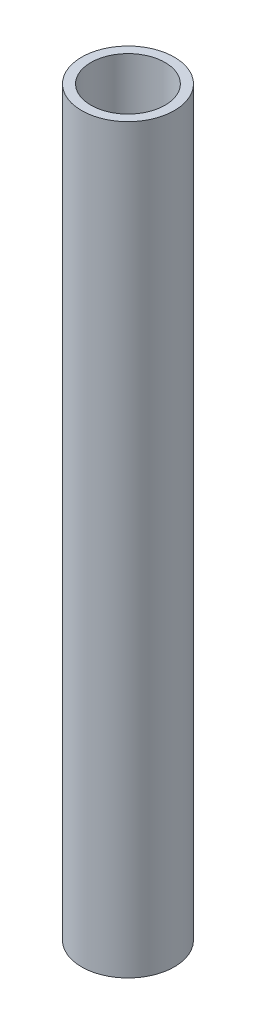
ISO-10303-21;
HEADER;
FILE_DESCRIPTION(('STEP AP214'),'2;1');
FILE_NAME('part.step','',(''),(''),'','','');
FILE_SCHEMA(('AUTOMOTIVE_DESIGN { 1 0 10303 214 1 1 1 1 }'));
ENDSEC;
DATA;
#1=APPLICATION_CONTEXT('core data for automotive mechanical design processes');
#2=APPLICATION_PROTOCOL_DEFINITION('international standard','automotive_design',2000,#1);
#3=PRODUCT_CONTEXT('',#1,'mechanical');
#4=PRODUCT('Part','Part','',(#3));
#5=PRODUCT_RELATED_PRODUCT_CATEGORY('part','',(#4));
#6=PRODUCT_DEFINITION_FORMATION('','',#4);
#7=PRODUCT_DEFINITION_CONTEXT('part definition',#1,'design');
#8=PRODUCT_DEFINITION('design','',#6,#7);
#9=PRODUCT_DEFINITION_SHAPE('','',#8);
#10=(LENGTH_UNIT() NAMED_UNIT(*) SI_UNIT(.MILLI.,.METRE.));
#11=(NAMED_UNIT(*) PLANE_ANGLE_UNIT() SI_UNIT($,.RADIAN.));
#12=(NAMED_UNIT(*) SI_UNIT($,.STERADIAN.) SOLID_ANGLE_UNIT());
#13=UNCERTAINTY_MEASURE_WITH_UNIT(LENGTH_MEASURE(1.E-05),#10,'distance_accuracy_value','');
#14=(GEOMETRIC_REPRESENTATION_CONTEXT(3) GLOBAL_UNCERTAINTY_ASSIGNED_CONTEXT((#13)) GLOBAL_UNIT_ASSIGNED_CONTEXT((#10,
#11,#12)) REPRESENTATION_CONTEXT('',''));
#15=CARTESIAN_POINT('',(0.,0.,0.));
#16=DIRECTION('',(0.,0.,1.));
#17=DIRECTION('',(1.,0.,0.));
#18=AXIS2_PLACEMENT_3D('',#15,#16,#17);
#19=CARTESIAN_POINT('',(0.,40.,0.));
#20=DIRECTION('',(0.,1.,0.));
#21=DIRECTION('',(0.,0.,1.));
#22=AXIS2_PLACEMENT_3D('',#19,#20,#21);
#23=PLANE('',#22);
#24=CARTESIAN_POINT('',(0.,40.,0.));
#25=DIRECTION('',(0.,1.,0.));
#26=DIRECTION('',(0.,0.,1.));
#27=AXIS2_PLACEMENT_3D('',#24,#25,#26);
#28=CIRCLE('',#27,2.5);
#29=CARTESIAN_POINT('',(0.,40.,2.5));
#30=VERTEX_POINT('',#29);
#31=EDGE_CURVE('E10',#30,#30,#28,.T.);
#32=ORIENTED_EDGE('',*,*,#31,.T.);
#33=EDGE_LOOP('',(#32));
#34=FACE_BOUND('',#33,.T.);
#35=CARTESIAN_POINT('',(0.,40.,0.));
#36=DIRECTION('',(0.,1.,0.));
#37=DIRECTION('',(0.,0.,1.));
#38=AXIS2_PLACEMENT_3D('',#35,#36,#37);
#39=CIRCLE('',#38,2.);
#40=CARTESIAN_POINT('',(0.,40.,2.));
#41=VERTEX_POINT('',#40);
#42=EDGE_CURVE('E44',#41,#41,#39,.T.);
#43=ORIENTED_EDGE('',*,*,#42,.F.);
#44=EDGE_LOOP('',(#43));
#45=FACE_BOUND('',#44,.T.);
#46=ADVANCED_FACE('F33',(#34,#45),#23,.T.);
#47=CARTESIAN_POINT('',(0.,0.,0.));
#48=DIRECTION('',(0.,1.,0.));
#49=DIRECTION('',(0.,0.,1.));
#50=AXIS2_PLACEMENT_3D('',#47,#48,#49);
#51=PLANE('',#50);
#52=CARTESIAN_POINT('',(0.,0.,0.));
#53=DIRECTION('',(0.,1.,0.));
#54=DIRECTION('',(0.,0.,1.));
#55=AXIS2_PLACEMENT_3D('',#52,#53,#54);
#56=CIRCLE('',#55,2.5);
#57=CARTESIAN_POINT('',(0.,0.,2.5));
#58=VERTEX_POINT('',#57);
#59=EDGE_CURVE('E37',#58,#58,#56,.T.);
#60=ORIENTED_EDGE('',*,*,#59,.F.);
#61=EDGE_LOOP('',(#60));
#62=FACE_BOUND('',#61,.T.);
#63=CARTESIAN_POINT('',(0.,0.,0.));
#64=DIRECTION('',(0.,1.,0.));
#65=DIRECTION('',(0.,0.,1.));
#66=AXIS2_PLACEMENT_3D('',#63,#64,#65);
#67=CIRCLE('',#66,2.);
#68=CARTESIAN_POINT('',(0.,0.,2.));
#69=VERTEX_POINT('',#68);
#70=EDGE_CURVE('E46',#69,#69,#67,.T.);
#71=ORIENTED_EDGE('',*,*,#70,.T.);
#72=EDGE_LOOP('',(#71));
#73=FACE_BOUND('',#72,.T.);
#74=ADVANCED_FACE('F56',(#62,#73),#51,.F.);
#75=CARTESIAN_POINT('',(0.,40.,0.));
#76=DIRECTION('',(0.,-1.,0.));
#77=DIRECTION('',(0.,0.,-1.));
#78=AXIS2_PLACEMENT_3D('',#75,#76,#77);
#79=CYLINDRICAL_SURFACE('',#78,2.5);
#80=ORIENTED_EDGE('',*,*,#31,.F.);
#81=EDGE_LOOP('',(#80));
#82=FACE_BOUND('',#81,.T.);
#83=ORIENTED_EDGE('',*,*,#59,.T.);
#84=EDGE_LOOP('',(#83));
#85=FACE_BOUND('',#84,.T.);
#86=ADVANCED_FACE('F35',(#82,#85),#79,.T.);
#87=CARTESIAN_POINT('',(0.,40.,0.));
#88=DIRECTION('',(0.,-1.,0.));
#89=DIRECTION('',(0.,0.,-1.));
#90=AXIS2_PLACEMENT_3D('',#87,#88,#89);
#91=CYLINDRICAL_SURFACE('',#90,2.);
#92=ORIENTED_EDGE('',*,*,#42,.T.);
#93=EDGE_LOOP('',(#92));
#94=FACE_BOUND('',#93,.T.);
#95=ORIENTED_EDGE('',*,*,#70,.F.);
#96=EDGE_LOOP('',(#95));
#97=FACE_BOUND('',#96,.T.);
#98=ADVANCED_FACE('F52',(#94,#97),#91,.F.);
#99=CLOSED_SHELL('',(#46,#74,#86,#98));
#100=MANIFOLD_SOLID_BREP('B2',#99);
#101=ADVANCED_BREP_SHAPE_REPRESENTATION('',(#18,#100),#14);
#102=SHAPE_DEFINITION_REPRESENTATION(#9,#101);
ENDSEC;
END-ISO-10303-21;
